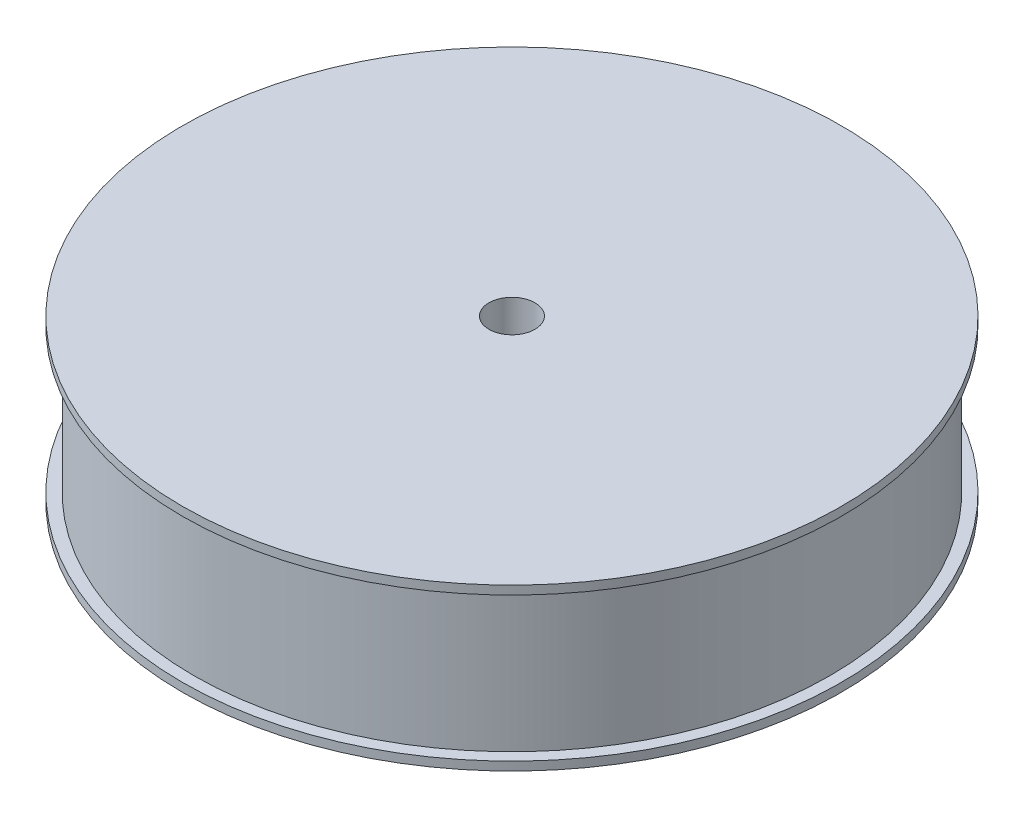
ISO-10303-21;
HEADER;
FILE_DESCRIPTION(('STEP AP214'),'2;1');
FILE_NAME('part.step','',(''),(''),'','','');
FILE_SCHEMA(('AUTOMOTIVE_DESIGN { 1 0 10303 214 1 1 1 1 }'));
ENDSEC;
DATA;
#1=APPLICATION_CONTEXT('core data for automotive mechanical design processes');
#2=APPLICATION_PROTOCOL_DEFINITION('international standard','automotive_design',2000,#1);
#3=PRODUCT_CONTEXT('',#1,'mechanical');
#4=PRODUCT('Part','Part','',(#3));
#5=PRODUCT_RELATED_PRODUCT_CATEGORY('part','',(#4));
#6=PRODUCT_DEFINITION_FORMATION('','',#4);
#7=PRODUCT_DEFINITION_CONTEXT('part definition',#1,'design');
#8=PRODUCT_DEFINITION('design','',#6,#7);
#9=PRODUCT_DEFINITION_SHAPE('','',#8);
#10=(LENGTH_UNIT() NAMED_UNIT(*) SI_UNIT(.MILLI.,.METRE.));
#11=(NAMED_UNIT(*) PLANE_ANGLE_UNIT() SI_UNIT($,.RADIAN.));
#12=(NAMED_UNIT(*) SI_UNIT($,.STERADIAN.) SOLID_ANGLE_UNIT());
#13=UNCERTAINTY_MEASURE_WITH_UNIT(LENGTH_MEASURE(1.E-05),#10,'distance_accuracy_value','');
#14=(GEOMETRIC_REPRESENTATION_CONTEXT(3) GLOBAL_UNCERTAINTY_ASSIGNED_CONTEXT((#13)) GLOBAL_UNIT_ASSIGNED_CONTEXT((#10,
#11,#12)) REPRESENTATION_CONTEXT('',''));
#15=CARTESIAN_POINT('',(0.,0.,0.));
#16=DIRECTION('',(0.,0.,1.));
#17=DIRECTION('',(1.,0.,0.));
#18=AXIS2_PLACEMENT_3D('',#15,#16,#17);
#19=CARTESIAN_POINT('',(0.,10.3155225102178,0.));
#20=DIRECTION('',(0.,1.,0.));
#21=DIRECTION('',(0.,0.,1.));
#22=AXIS2_PLACEMENT_3D('',#19,#20,#21);
#23=CYLINDRICAL_SURFACE('',#22,57.295);
#24=CARTESIAN_POINT('',(0.,-12.5,0.));
#25=DIRECTION('',(0.,1.,0.));
#26=DIRECTION('',(0.,0.,1.));
#27=AXIS2_PLACEMENT_3D('',#24,#25,#26);
#28=CIRCLE('',#27,57.295);
#29=CARTESIAN_POINT('',(0.,-12.5,57.295));
#30=VERTEX_POINT('',#29);
#31=EDGE_CURVE('E72',#30,#30,#28,.T.);
#32=ORIENTED_EDGE('',*,*,#31,.F.);
#33=EDGE_LOOP('',(#32));
#34=FACE_BOUND('',#33,.T.);
#35=CARTESIAN_POINT('',(0.,-14.,0.));
#36=DIRECTION('',(0.,1.,0.));
#37=DIRECTION('',(0.,0.,1.));
#38=AXIS2_PLACEMENT_3D('',#35,#36,#37);
#39=CIRCLE('',#38,57.295);
#40=CARTESIAN_POINT('',(0.,-14.,57.295));
#41=VERTEX_POINT('',#40);
#42=EDGE_CURVE('E10',#41,#41,#39,.T.);
#43=ORIENTED_EDGE('',*,*,#42,.T.);
#44=EDGE_LOOP('',(#43));
#45=FACE_BOUND('',#44,.T.);
#46=ADVANCED_FACE('F37',(#34,#45),#23,.T.);
#47=CARTESIAN_POINT('',(0.,-14.,-57.295));
#48=DIRECTION('',(0.,1.,0.));
#49=DIRECTION('',(0.,0.,1.));
#50=AXIS2_PLACEMENT_3D('',#47,#48,#49);
#51=PLANE('',#50);
#52=ORIENTED_EDGE('',*,*,#42,.F.);
#53=EDGE_LOOP('',(#52));
#54=FACE_BOUND('',#53,.T.);
#55=CARTESIAN_POINT('',(0.,-14.,0.));
#56=DIRECTION('',(0.,1.,0.));
#57=DIRECTION('',(0.,0.,1.));
#58=AXIS2_PLACEMENT_3D('',#55,#56,#57);
#59=CIRCLE('',#58,4.);
#60=CARTESIAN_POINT('',(0.,-14.,4.));
#61=VERTEX_POINT('',#60);
#62=EDGE_CURVE('E44',#61,#61,#59,.T.);
#63=ORIENTED_EDGE('',*,*,#62,.T.);
#64=EDGE_LOOP('',(#63));
#65=FACE_BOUND('',#64,.T.);
#66=ADVANCED_FACE('F80',(#54,#65),#51,.F.);
#67=CARTESIAN_POINT('',(0.,10.3155225102178,0.));
#68=DIRECTION('',(0.,1.,0.));
#69=DIRECTION('',(0.,0.,1.));
#70=AXIS2_PLACEMENT_3D('',#67,#68,#69);
#71=CYLINDRICAL_SURFACE('',#70,4.);
#72=ORIENTED_EDGE('',*,*,#62,.F.);
#73=EDGE_LOOP('',(#72));
#74=FACE_BOUND('',#73,.T.);
#75=CARTESIAN_POINT('',(0.,14.,0.));
#76=DIRECTION('',(0.,1.,0.));
#77=DIRECTION('',(0.,0.,1.));
#78=AXIS2_PLACEMENT_3D('',#75,#76,#77);
#79=CIRCLE('',#78,4.);
#80=CARTESIAN_POINT('',(0.,14.,4.));
#81=VERTEX_POINT('',#80);
#82=EDGE_CURVE('E49',#81,#81,#79,.T.);
#83=ORIENTED_EDGE('',*,*,#82,.T.);
#84=EDGE_LOOP('',(#83));
#85=FACE_BOUND('',#84,.T.);
#86=ADVANCED_FACE('F84',(#74,#85),#71,.F.);
#87=CARTESIAN_POINT('',(0.,14.,-57.295));
#88=DIRECTION('',(0.,-1.,0.));
#89=DIRECTION('',(0.,0.,-1.));
#90=AXIS2_PLACEMENT_3D('',#87,#88,#89);
#91=PLANE('',#90);
#92=ORIENTED_EDGE('',*,*,#82,.F.);
#93=EDGE_LOOP('',(#92));
#94=FACE_BOUND('',#93,.T.);
#95=CARTESIAN_POINT('',(0.,14.,0.));
#96=DIRECTION('',(0.,1.,0.));
#97=DIRECTION('',(0.,0.,1.));
#98=AXIS2_PLACEMENT_3D('',#95,#96,#97);
#99=CIRCLE('',#98,57.295);
#100=CARTESIAN_POINT('',(0.,14.,57.295));
#101=VERTEX_POINT('',#100);
#102=EDGE_CURVE('E54',#101,#101,#99,.T.);
#103=ORIENTED_EDGE('',*,*,#102,.T.);
#104=EDGE_LOOP('',(#103));
#105=FACE_BOUND('',#104,.T.);
#106=ADVANCED_FACE('F89',(#94,#105),#91,.F.);
#107=CARTESIAN_POINT('',(0.,10.3155225102178,0.));
#108=DIRECTION('',(0.,1.,0.));
#109=DIRECTION('',(0.,0.,1.));
#110=AXIS2_PLACEMENT_3D('',#107,#108,#109);
#111=CYLINDRICAL_SURFACE('',#110,57.295);
#112=ORIENTED_EDGE('',*,*,#102,.F.);
#113=EDGE_LOOP('',(#112));
#114=FACE_BOUND('',#113,.T.);
#115=CARTESIAN_POINT('',(0.,12.5,0.));
#116=DIRECTION('',(0.,1.,0.));
#117=DIRECTION('',(0.,0.,1.));
#118=AXIS2_PLACEMENT_3D('',#115,#116,#117);
#119=CIRCLE('',#118,57.295);
#120=CARTESIAN_POINT('',(0.,12.5,57.295));
#121=VERTEX_POINT('',#120);
#122=EDGE_CURVE('E60',#121,#121,#119,.T.);
#123=ORIENTED_EDGE('',*,*,#122,.T.);
#124=EDGE_LOOP('',(#123));
#125=FACE_BOUND('',#124,.T.);
#126=ADVANCED_FACE('F95',(#114,#125),#111,.T.);
#127=CARTESIAN_POINT('',(0.,12.5,-55.295));
#128=DIRECTION('',(0.,1.,0.));
#129=DIRECTION('',(0.,0.,1.));
#130=AXIS2_PLACEMENT_3D('',#127,#128,#129);
#131=PLANE('',#130);
#132=ORIENTED_EDGE('',*,*,#122,.F.);
#133=EDGE_LOOP('',(#132));
#134=FACE_BOUND('',#133,.T.);
#135=CARTESIAN_POINT('',(0.,12.5,0.));
#136=DIRECTION('',(0.,1.,0.));
#137=DIRECTION('',(0.,0.,1.));
#138=AXIS2_PLACEMENT_3D('',#135,#136,#137);
#139=CIRCLE('',#138,55.295);
#140=CARTESIAN_POINT('',(0.,12.5,55.295));
#141=VERTEX_POINT('',#140);
#142=EDGE_CURVE('E64',#141,#141,#139,.T.);
#143=ORIENTED_EDGE('',*,*,#142,.T.);
#144=EDGE_LOOP('',(#143));
#145=FACE_BOUND('',#144,.T.);
#146=ADVANCED_FACE('F99',(#134,#145),#131,.F.);
#147=CARTESIAN_POINT('',(0.,10.3155225102178,0.));
#148=DIRECTION('',(0.,1.,0.));
#149=DIRECTION('',(0.,0.,1.));
#150=AXIS2_PLACEMENT_3D('',#147,#148,#149);
#151=CYLINDRICAL_SURFACE('',#150,55.295);
#152=ORIENTED_EDGE('',*,*,#142,.F.);
#153=EDGE_LOOP('',(#152));
#154=FACE_BOUND('',#153,.T.);
#155=CARTESIAN_POINT('',(0.,-12.5,0.));
#156=DIRECTION('',(0.,1.,0.));
#157=DIRECTION('',(0.,0.,1.));
#158=AXIS2_PLACEMENT_3D('',#155,#156,#157);
#159=CIRCLE('',#158,55.295);
#160=CARTESIAN_POINT('',(0.,-12.5,55.295));
#161=VERTEX_POINT('',#160);
#162=EDGE_CURVE('E68',#161,#161,#159,.T.);
#163=ORIENTED_EDGE('',*,*,#162,.T.);
#164=EDGE_LOOP('',(#163));
#165=FACE_BOUND('',#164,.T.);
#166=ADVANCED_FACE('F103',(#154,#165),#151,.T.);
#167=CARTESIAN_POINT('',(0.,-12.5,-55.295));
#168=DIRECTION('',(0.,-1.,0.));
#169=DIRECTION('',(0.,0.,-1.));
#170=AXIS2_PLACEMENT_3D('',#167,#168,#169);
#171=PLANE('',#170);
#172=ORIENTED_EDGE('',*,*,#162,.F.);
#173=EDGE_LOOP('',(#172));
#174=FACE_BOUND('',#173,.T.);
#175=ORIENTED_EDGE('',*,*,#31,.T.);
#176=EDGE_LOOP('',(#175));
#177=FACE_BOUND('',#176,.T.);
#178=ADVANCED_FACE('F77',(#174,#177),#171,.F.);
#179=CLOSED_SHELL('',(#46,#66,#86,#106,#126,#146,#166,#178));
#180=MANIFOLD_SOLID_BREP('B2',#179);
#181=ADVANCED_BREP_SHAPE_REPRESENTATION('',(#18,#180),#14);
#182=SHAPE_DEFINITION_REPRESENTATION(#9,#181);
ENDSEC;
END-ISO-10303-21;
